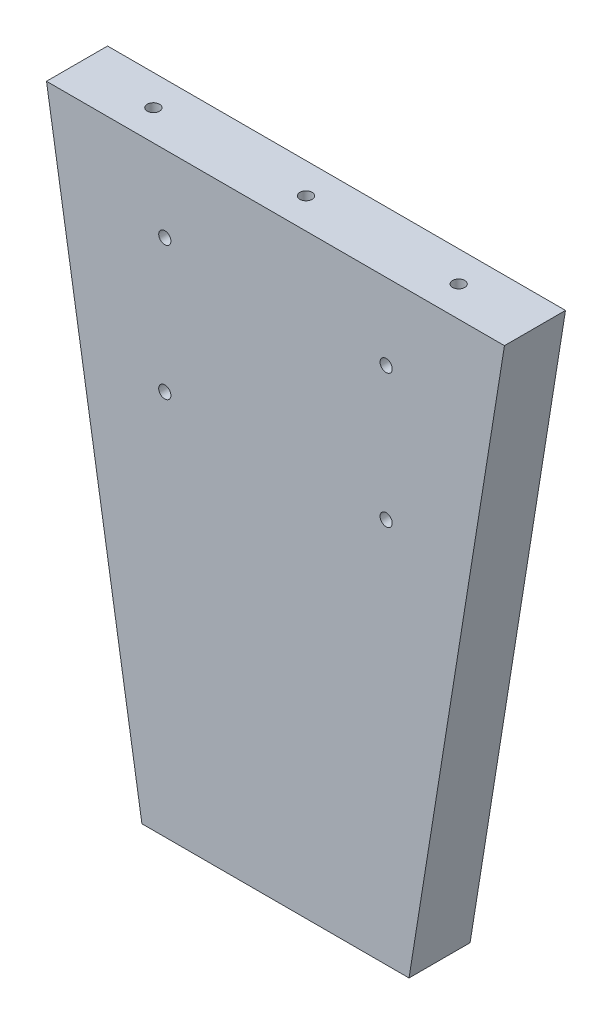
ISO-10303-21;
HEADER;
FILE_DESCRIPTION(('STEP AP214'),'2;1');
FILE_NAME('part.step','',(''),(''),'','','');
FILE_SCHEMA(('AUTOMOTIVE_DESIGN { 1 0 10303 214 1 1 1 1 }'));
ENDSEC;
DATA;
#1=APPLICATION_CONTEXT('core data for automotive mechanical design processes');
#2=APPLICATION_PROTOCOL_DEFINITION('international standard','automotive_design',2000,#1);
#3=PRODUCT_CONTEXT('',#1,'mechanical');
#4=PRODUCT('Part','Part','',(#3));
#5=PRODUCT_RELATED_PRODUCT_CATEGORY('part','',(#4));
#6=PRODUCT_DEFINITION_FORMATION('','',#4);
#7=PRODUCT_DEFINITION_CONTEXT('part definition',#1,'design');
#8=PRODUCT_DEFINITION('design','',#6,#7);
#9=PRODUCT_DEFINITION_SHAPE('','',#8);
#10=(LENGTH_UNIT() NAMED_UNIT(*) SI_UNIT(.MILLI.,.METRE.));
#11=(NAMED_UNIT(*) PLANE_ANGLE_UNIT() SI_UNIT($,.RADIAN.));
#12=(NAMED_UNIT(*) SI_UNIT($,.STERADIAN.) SOLID_ANGLE_UNIT());
#13=UNCERTAINTY_MEASURE_WITH_UNIT(LENGTH_MEASURE(1.E-05),#10,'distance_accuracy_value','');
#14=(GEOMETRIC_REPRESENTATION_CONTEXT(3) GLOBAL_UNCERTAINTY_ASSIGNED_CONTEXT((#13)) GLOBAL_UNIT_ASSIGNED_CONTEXT((#10,
#11,#12)) REPRESENTATION_CONTEXT('',''));
#15=CARTESIAN_POINT('',(0.,0.,0.));
#16=DIRECTION('',(0.,0.,1.));
#17=DIRECTION('',(1.,0.,0.));
#18=AXIS2_PLACEMENT_3D('',#15,#16,#17);
#19=CARTESIAN_POINT('',(0.,156.,8.));
#20=DIRECTION('',(0.,-1.,0.));
#21=DIRECTION('',(0.,0.,-1.));
#22=AXIS2_PLACEMENT_3D('',#19,#20,#21);
#23=PLANE('',#22);
#24=CARTESIAN_POINT('',(40.,156.,0.));
#25=DIRECTION('',(0.,-1.,0.));
#26=DIRECTION('',(0.,0.,-1.));
#27=AXIS2_PLACEMENT_3D('',#24,#25,#26);
#28=CIRCLE('',#27,1.59999999999999);
#29=CARTESIAN_POINT('',(40.,156.,-1.59999999999999));
#30=VERTEX_POINT('',#29);
#31=EDGE_CURVE('E42',#30,#30,#28,.T.);
#32=ORIENTED_EDGE('',*,*,#31,.T.);
#33=EDGE_LOOP('',(#32));
#34=FACE_BOUND('',#33,.T.);
#35=CARTESIAN_POINT('',(0.,156.,0.));
#36=DIRECTION('',(0.,-1.,0.));
#37=DIRECTION('',(0.,0.,-1.));
#38=AXIS2_PLACEMENT_3D('',#35,#36,#37);
#39=CIRCLE('',#38,1.59999999999999);
#40=CARTESIAN_POINT('',(0.,156.,-1.59999999999999));
#41=VERTEX_POINT('',#40);
#42=EDGE_CURVE('E135',#41,#41,#39,.T.);
#43=ORIENTED_EDGE('',*,*,#42,.T.);
#44=EDGE_LOOP('',(#43));
#45=FACE_BOUND('',#44,.T.);
#46=CARTESIAN_POINT('',(-40.,156.,0.));
#47=DIRECTION('',(0.,-1.,0.));
#48=DIRECTION('',(0.,0.,-1.));
#49=AXIS2_PLACEMENT_3D('',#46,#47,#48);
#50=CIRCLE('',#49,1.59999999999999);
#51=CARTESIAN_POINT('',(-40.,156.,-1.59999999999999));
#52=VERTEX_POINT('',#51);
#53=EDGE_CURVE('E131',#52,#52,#50,.T.);
#54=ORIENTED_EDGE('',*,*,#53,.T.);
#55=EDGE_LOOP('',(#54));
#56=FACE_BOUND('',#55,.T.);
#57=DIRECTION('',(-1.,0.,0.));
#58=VECTOR('',#57,1.);
#59=CARTESIAN_POINT('',(0.,156.,-8.));
#60=LINE('',#59,#58);
#61=CARTESIAN_POINT('',(60.,156.,-8.));
#62=VERTEX_POINT('',#61);
#63=CARTESIAN_POINT('',(-60.,156.,-8.));
#64=VERTEX_POINT('',#63);
#65=EDGE_CURVE('E90',#62,#64,#60,.T.);
#66=ORIENTED_EDGE('',*,*,#65,.T.);
#67=DIRECTION('',(0.,0.,-1.));
#68=VECTOR('',#67,1.);
#69=CARTESIAN_POINT('',(-60.,156.,8.));
#70=LINE('',#69,#68);
#71=CARTESIAN_POINT('',(-60.,156.,8.));
#72=VERTEX_POINT('',#71);
#73=EDGE_CURVE('E97',#72,#64,#70,.T.);
#74=ORIENTED_EDGE('',*,*,#73,.F.);
#75=DIRECTION('',(-1.,0.,0.));
#76=VECTOR('',#75,1.);
#77=CARTESIAN_POINT('',(0.,156.,8.));
#78=LINE('',#77,#76);
#79=CARTESIAN_POINT('',(60.,156.,8.));
#80=VERTEX_POINT('',#79);
#81=EDGE_CURVE('E114',#80,#72,#78,.T.);
#82=ORIENTED_EDGE('',*,*,#81,.F.);
#83=DIRECTION('',(0.,0.,-1.));
#84=VECTOR('',#83,1.);
#85=CARTESIAN_POINT('',(60.,156.,8.));
#86=LINE('',#85,#84);
#87=EDGE_CURVE('E48',#80,#62,#86,.T.);
#88=ORIENTED_EDGE('',*,*,#87,.T.);
#89=EDGE_LOOP('',(#66,#74,#82,#88));
#90=FACE_BOUND('',#89,.T.);
#91=ADVANCED_FACE('F39',(#34,#45,#56,#90),#23,.F.);
#92=CARTESIAN_POINT('',(35.,0.,8.));
#93=DIRECTION('',(0.,1.,0.));
#94=DIRECTION('',(-1.,0.,0.));
#95=AXIS2_PLACEMENT_3D('',#92,#93,#94);
#96=PLANE('',#95);
#97=DIRECTION('',(1.,0.,0.));
#98=VECTOR('',#97,1.);
#99=CARTESIAN_POINT('',(35.,0.,-8.));
#100=LINE('',#99,#98);
#101=CARTESIAN_POINT('',(-35.,0.,-8.));
#102=VERTEX_POINT('',#101);
#103=CARTESIAN_POINT('',(35.,0.,-8.));
#104=VERTEX_POINT('',#103);
#105=EDGE_CURVE('E68',#102,#104,#100,.T.);
#106=ORIENTED_EDGE('',*,*,#105,.T.);
#107=DIRECTION('',(0.,0.,-1.));
#108=VECTOR('',#107,1.);
#109=CARTESIAN_POINT('',(35.,0.,8.));
#110=LINE('',#109,#108);
#111=CARTESIAN_POINT('',(35.,0.,8.));
#112=VERTEX_POINT('',#111);
#113=EDGE_CURVE('E11',#112,#104,#110,.T.);
#114=ORIENTED_EDGE('',*,*,#113,.F.);
#115=DIRECTION('',(1.,0.,0.));
#116=VECTOR('',#115,1.);
#117=CARTESIAN_POINT('',(35.,0.,8.));
#118=LINE('',#117,#116);
#119=CARTESIAN_POINT('',(-35.,0.,8.));
#120=VERTEX_POINT('',#119);
#121=EDGE_CURVE('E73',#120,#112,#118,.T.);
#122=ORIENTED_EDGE('',*,*,#121,.F.);
#123=DIRECTION('',(0.,0.,-1.));
#124=VECTOR('',#123,1.);
#125=CARTESIAN_POINT('',(-35.,0.,8.));
#126=LINE('',#125,#124);
#127=EDGE_CURVE('E92',#120,#102,#126,.T.);
#128=ORIENTED_EDGE('',*,*,#127,.T.);
#129=EDGE_LOOP('',(#106,#114,#122,#128));
#130=FACE_BOUND('',#129,.T.);
#131=ADVANCED_FACE('F93',(#130),#96,.F.);
#132=CARTESIAN_POINT('',(35.,0.,8.));
#133=DIRECTION('',(-0.987401103435145,0.158237356319735,0.));
#134=DIRECTION('',(-0.158237356319735,-0.987401103435145,0.));
#135=AXIS2_PLACEMENT_3D('',#132,#133,#134);
#136=PLANE('',#135);
#137=DIRECTION('',(0.158237356319735,0.987401103435145,0.));
#138=VECTOR('',#137,1.);
#139=CARTESIAN_POINT('',(35.,0.,-8.));
#140=LINE('',#139,#138);
#141=EDGE_CURVE('E89',#104,#62,#140,.T.);
#142=ORIENTED_EDGE('',*,*,#141,.T.);
#143=ORIENTED_EDGE('',*,*,#87,.F.);
#144=DIRECTION('',(0.158237356319735,0.987401103435145,0.));
#145=VECTOR('',#144,1.);
#146=CARTESIAN_POINT('',(35.,0.,8.));
#147=LINE('',#146,#145);
#148=EDGE_CURVE('E57',#112,#80,#147,.T.);
#149=ORIENTED_EDGE('',*,*,#148,.F.);
#150=ORIENTED_EDGE('',*,*,#113,.T.);
#151=EDGE_LOOP('',(#142,#143,#149,#150));
#152=FACE_BOUND('',#151,.T.);
#153=ADVANCED_FACE('F199',(#152),#136,.F.);
#154=CARTESIAN_POINT('',(0.,0.,8.));
#155=DIRECTION('',(0.,0.,1.));
#156=DIRECTION('',(1.,0.,0.));
#157=AXIS2_PLACEMENT_3D('',#154,#155,#156);
#158=PLANE('',#157);
#159=CARTESIAN_POINT('',(-28.9999999999999,136.,8.));
#160=DIRECTION('',(0.,0.,1.));
#161=DIRECTION('',(1.,0.,0.));
#162=AXIS2_PLACEMENT_3D('',#159,#160,#161);
#163=CIRCLE('',#162,1.59999999999997);
#164=CARTESIAN_POINT('',(-27.3999999999999,136.,8.));
#165=VERTEX_POINT('',#164);
#166=EDGE_CURVE('E155',#165,#165,#163,.T.);
#167=ORIENTED_EDGE('',*,*,#166,.F.);
#168=EDGE_LOOP('',(#167));
#169=FACE_BOUND('',#168,.T.);
#170=CARTESIAN_POINT('',(-28.9999999999999,101.,8.));
#171=DIRECTION('',(0.,0.,1.));
#172=DIRECTION('',(1.,0.,0.));
#173=AXIS2_PLACEMENT_3D('',#170,#171,#172);
#174=CIRCLE('',#173,1.59999999999997);
#175=CARTESIAN_POINT('',(-27.3999999999999,101.,8.));
#176=VERTEX_POINT('',#175);
#177=EDGE_CURVE('E164',#176,#176,#174,.T.);
#178=ORIENTED_EDGE('',*,*,#177,.F.);
#179=EDGE_LOOP('',(#178));
#180=FACE_BOUND('',#179,.T.);
#181=CARTESIAN_POINT('',(29.0000000000001,101.,8.));
#182=DIRECTION('',(0.,0.,1.));
#183=DIRECTION('',(1.,0.,0.));
#184=AXIS2_PLACEMENT_3D('',#181,#182,#183);
#185=CIRCLE('',#184,1.59999999999997);
#186=CARTESIAN_POINT('',(30.6000000000001,101.,8.));
#187=VERTEX_POINT('',#186);
#188=EDGE_CURVE('E126',#187,#187,#185,.T.);
#189=ORIENTED_EDGE('',*,*,#188,.F.);
#190=EDGE_LOOP('',(#189));
#191=FACE_BOUND('',#190,.T.);
#192=CARTESIAN_POINT('',(29.0000000000001,136.,8.));
#193=DIRECTION('',(0.,0.,1.));
#194=DIRECTION('',(1.,0.,0.));
#195=AXIS2_PLACEMENT_3D('',#192,#193,#194);
#196=CIRCLE('',#195,1.59999999999997);
#197=CARTESIAN_POINT('',(30.6000000000001,136.,8.));
#198=VERTEX_POINT('',#197);
#199=EDGE_CURVE('E104',#198,#198,#196,.T.);
#200=ORIENTED_EDGE('',*,*,#199,.F.);
#201=EDGE_LOOP('',(#200));
#202=FACE_BOUND('',#201,.T.);
#203=ORIENTED_EDGE('',*,*,#81,.T.);
#204=DIRECTION('',(-0.158237356319735,0.987401103435145,0.));
#205=VECTOR('',#204,1.);
#206=CARTESIAN_POINT('',(-35.,0.,8.));
#207=LINE('',#206,#205);
#208=EDGE_CURVE('E98',#120,#72,#207,.T.);
#209=ORIENTED_EDGE('',*,*,#208,.F.);
#210=ORIENTED_EDGE('',*,*,#121,.T.);
#211=ORIENTED_EDGE('',*,*,#148,.T.);
#212=EDGE_LOOP('',(#203,#209,#210,#211));
#213=FACE_BOUND('',#212,.T.);
#214=ADVANCED_FACE('F191',(#169,#180,#191,#202,#213),#158,.T.);
#215=CARTESIAN_POINT('',(0.,0.,-8.));
#216=DIRECTION('',(0.,0.,1.));
#217=DIRECTION('',(1.,0.,0.));
#218=AXIS2_PLACEMENT_3D('',#215,#216,#217);
#219=PLANE('',#218);
#220=CARTESIAN_POINT('',(-28.9999999999999,136.,-7.99999999999999));
#221=DIRECTION('',(0.,0.,-1.));
#222=DIRECTION('',(-1.,0.,0.));
#223=AXIS2_PLACEMENT_3D('',#220,#221,#222);
#224=CIRCLE('',#223,3.15);
#225=CARTESIAN_POINT('',(-32.1499999999999,136.,-7.99999999999999));
#226=VERTEX_POINT('',#225);
#227=EDGE_CURVE('E133',#226,#226,#224,.T.);
#228=ORIENTED_EDGE('',*,*,#227,.F.);
#229=EDGE_LOOP('',(#228));
#230=FACE_BOUND('',#229,.T.);
#231=CARTESIAN_POINT('',(-28.9999999999999,101.,-7.99999999999999));
#232=DIRECTION('',(0.,0.,-1.));
#233=DIRECTION('',(-1.,0.,0.));
#234=AXIS2_PLACEMENT_3D('',#231,#232,#233);
#235=CIRCLE('',#234,3.15);
#236=CARTESIAN_POINT('',(-32.1499999999999,101.,-7.99999999999999));
#237=VERTEX_POINT('',#236);
#238=EDGE_CURVE('E161',#237,#237,#235,.T.);
#239=ORIENTED_EDGE('',*,*,#238,.F.);
#240=EDGE_LOOP('',(#239));
#241=FACE_BOUND('',#240,.T.);
#242=CARTESIAN_POINT('',(29.0000000000001,101.,-7.99999999999999));
#243=DIRECTION('',(0.,0.,-1.));
#244=DIRECTION('',(-1.,0.,0.));
#245=AXIS2_PLACEMENT_3D('',#242,#243,#244);
#246=CIRCLE('',#245,3.15);
#247=CARTESIAN_POINT('',(25.8500000000001,101.,-7.99999999999999));
#248=VERTEX_POINT('',#247);
#249=EDGE_CURVE('E172',#248,#248,#246,.T.);
#250=ORIENTED_EDGE('',*,*,#249,.F.);
#251=EDGE_LOOP('',(#250));
#252=FACE_BOUND('',#251,.T.);
#253=CARTESIAN_POINT('',(29.0000000000001,136.,-7.99999999999999));
#254=DIRECTION('',(0.,0.,-1.));
#255=DIRECTION('',(-1.,0.,0.));
#256=AXIS2_PLACEMENT_3D('',#253,#254,#255);
#257=CIRCLE('',#256,3.15);
#258=CARTESIAN_POINT('',(25.8500000000001,136.,-7.99999999999999));
#259=VERTEX_POINT('',#258);
#260=EDGE_CURVE('E129',#259,#259,#257,.T.);
#261=ORIENTED_EDGE('',*,*,#260,.F.);
#262=EDGE_LOOP('',(#261));
#263=FACE_BOUND('',#262,.T.);
#264=ORIENTED_EDGE('',*,*,#65,.F.);
#265=ORIENTED_EDGE('',*,*,#141,.F.);
#266=ORIENTED_EDGE('',*,*,#105,.F.);
#267=DIRECTION('',(-0.158237356319735,0.987401103435145,0.));
#268=VECTOR('',#267,1.);
#269=CARTESIAN_POINT('',(-35.,0.,-8.));
#270=LINE('',#269,#268);
#271=EDGE_CURVE('E88',#102,#64,#270,.T.);
#272=ORIENTED_EDGE('',*,*,#271,.T.);
#273=EDGE_LOOP('',(#264,#265,#266,#272));
#274=FACE_BOUND('',#273,.T.);
#275=ADVANCED_FACE('F86',(#230,#241,#252,#263,#274),#219,.F.);
#276=CARTESIAN_POINT('',(-35.,0.,8.));
#277=DIRECTION('',(-0.987401103435145,-0.158237356319735,0.));
#278=DIRECTION('',(0.158237356319735,-0.987401103435145,0.));
#279=AXIS2_PLACEMENT_3D('',#276,#277,#278);
#280=PLANE('',#279);
#281=ORIENTED_EDGE('',*,*,#271,.F.);
#282=ORIENTED_EDGE('',*,*,#127,.F.);
#283=ORIENTED_EDGE('',*,*,#208,.T.);
#284=ORIENTED_EDGE('',*,*,#73,.T.);
#285=EDGE_LOOP('',(#281,#282,#283,#284));
#286=FACE_BOUND('',#285,.T.);
#287=ADVANCED_FACE('F101',(#286),#280,.T.);
#288=CARTESIAN_POINT('',(29.0000000000001,136.,-7.99999999999999));
#289=DIRECTION('',(0.,0.,-1.));
#290=DIRECTION('',(-1.,0.,0.));
#291=AXIS2_PLACEMENT_3D('',#288,#289,#290);
#292=CYLINDRICAL_SURFACE('',#291,1.59999999999997);
#293=ORIENTED_EDGE('',*,*,#199,.T.);
#294=EDGE_LOOP('',(#293));
#295=FACE_BOUND('',#294,.T.);
#296=CARTESIAN_POINT('',(29.0000000000001,136.,-6.44999999999994));
#297=DIRECTION('',(0.,0.,-1.));
#298=DIRECTION('',(-1.,0.,0.));
#299=AXIS2_PLACEMENT_3D('',#296,#297,#298);
#300=CIRCLE('',#299,1.59999999999996);
#301=CARTESIAN_POINT('',(27.4000000000001,136.,-6.44999999999994));
#302=VERTEX_POINT('',#301);
#303=EDGE_CURVE('E109',#302,#302,#300,.T.);
#304=ORIENTED_EDGE('',*,*,#303,.T.);
#305=EDGE_LOOP('',(#304));
#306=FACE_BOUND('',#305,.T.);
#307=ADVANCED_FACE('F181',(#295,#306),#292,.F.);
#308=CARTESIAN_POINT('',(29.0000000000001,136.,-7.99999999999999));
#309=DIRECTION('',(0.,0.,-1.));
#310=DIRECTION('',(-1.,0.,0.));
#311=AXIS2_PLACEMENT_3D('',#308,#309,#310);
#312=CONICAL_SURFACE('',#311,3.15,0.785398163397445);
#313=ORIENTED_EDGE('',*,*,#303,.F.);
#314=EDGE_LOOP('',(#313));
#315=FACE_BOUND('',#314,.T.);
#316=ORIENTED_EDGE('',*,*,#260,.T.);
#317=EDGE_LOOP('',(#316));
#318=FACE_BOUND('',#317,.T.);
#319=ADVANCED_FACE('F183',(#315,#318),#312,.F.);
#320=CARTESIAN_POINT('',(29.0000000000001,101.,-7.99999999999999));
#321=DIRECTION('',(0.,0.,-1.));
#322=DIRECTION('',(-1.,0.,0.));
#323=AXIS2_PLACEMENT_3D('',#320,#321,#322);
#324=CYLINDRICAL_SURFACE('',#323,1.59999999999997);
#325=ORIENTED_EDGE('',*,*,#188,.T.);
#326=EDGE_LOOP('',(#325));
#327=FACE_BOUND('',#326,.T.);
#328=CARTESIAN_POINT('',(29.0000000000001,101.,-6.44999999999994));
#329=DIRECTION('',(0.,0.,-1.));
#330=DIRECTION('',(-1.,0.,0.));
#331=AXIS2_PLACEMENT_3D('',#328,#329,#330);
#332=CIRCLE('',#331,1.59999999999996);
#333=CARTESIAN_POINT('',(27.4000000000001,101.,-6.44999999999994));
#334=VERTEX_POINT('',#333);
#335=EDGE_CURVE('E130',#334,#334,#332,.T.);
#336=ORIENTED_EDGE('',*,*,#335,.T.);
#337=EDGE_LOOP('',(#336));
#338=FACE_BOUND('',#337,.T.);
#339=ADVANCED_FACE('F186',(#327,#338),#324,.F.);
#340=CARTESIAN_POINT('',(29.0000000000001,101.,-7.99999999999999));
#341=DIRECTION('',(0.,0.,-1.));
#342=DIRECTION('',(-1.,0.,0.));
#343=AXIS2_PLACEMENT_3D('',#340,#341,#342);
#344=CONICAL_SURFACE('',#343,3.15,0.785398163397445);
#345=ORIENTED_EDGE('',*,*,#335,.F.);
#346=EDGE_LOOP('',(#345));
#347=FACE_BOUND('',#346,.T.);
#348=ORIENTED_EDGE('',*,*,#249,.T.);
#349=EDGE_LOOP('',(#348));
#350=FACE_BOUND('',#349,.T.);
#351=ADVANCED_FACE('F249',(#347,#350),#344,.F.);
#352=CARTESIAN_POINT('',(-28.9999999999999,101.,-7.99999999999999));
#353=DIRECTION('',(0.,0.,-1.));
#354=DIRECTION('',(-1.,0.,0.));
#355=AXIS2_PLACEMENT_3D('',#352,#353,#354);
#356=CYLINDRICAL_SURFACE('',#355,1.59999999999997);
#357=ORIENTED_EDGE('',*,*,#177,.T.);
#358=EDGE_LOOP('',(#357));
#359=FACE_BOUND('',#358,.T.);
#360=CARTESIAN_POINT('',(-28.9999999999999,101.,-6.44999999999994));
#361=DIRECTION('',(0.,0.,-1.));
#362=DIRECTION('',(-1.,0.,0.));
#363=AXIS2_PLACEMENT_3D('',#360,#361,#362);
#364=CIRCLE('',#363,1.59999999999996);
#365=CARTESIAN_POINT('',(-30.5999999999999,101.,-6.44999999999994));
#366=VERTEX_POINT('',#365);
#367=EDGE_CURVE('E168',#366,#366,#364,.T.);
#368=ORIENTED_EDGE('',*,*,#367,.T.);
#369=EDGE_LOOP('',(#368));
#370=FACE_BOUND('',#369,.T.);
#371=ADVANCED_FACE('F256',(#359,#370),#356,.F.);
#372=CARTESIAN_POINT('',(-28.9999999999999,101.,-7.99999999999999));
#373=DIRECTION('',(0.,0.,-1.));
#374=DIRECTION('',(-1.,0.,0.));
#375=AXIS2_PLACEMENT_3D('',#372,#373,#374);
#376=CONICAL_SURFACE('',#375,3.15,0.785398163397445);
#377=ORIENTED_EDGE('',*,*,#367,.F.);
#378=EDGE_LOOP('',(#377));
#379=FACE_BOUND('',#378,.T.);
#380=ORIENTED_EDGE('',*,*,#238,.T.);
#381=EDGE_LOOP('',(#380));
#382=FACE_BOUND('',#381,.T.);
#383=ADVANCED_FACE('F264',(#379,#382),#376,.F.);
#384=CARTESIAN_POINT('',(-28.9999999999999,136.,-7.99999999999999));
#385=DIRECTION('',(0.,0.,-1.));
#386=DIRECTION('',(-1.,0.,0.));
#387=AXIS2_PLACEMENT_3D('',#384,#385,#386);
#388=CYLINDRICAL_SURFACE('',#387,1.59999999999997);
#389=ORIENTED_EDGE('',*,*,#166,.T.);
#390=EDGE_LOOP('',(#389));
#391=FACE_BOUND('',#390,.T.);
#392=CARTESIAN_POINT('',(-28.9999999999999,136.,-6.44999999999994));
#393=DIRECTION('',(0.,0.,-1.));
#394=DIRECTION('',(-1.,0.,0.));
#395=AXIS2_PLACEMENT_3D('',#392,#393,#394);
#396=CIRCLE('',#395,1.59999999999996);
#397=CARTESIAN_POINT('',(-30.5999999999999,136.,-6.44999999999994));
#398=VERTEX_POINT('',#397);
#399=EDGE_CURVE('E158',#398,#398,#396,.T.);
#400=ORIENTED_EDGE('',*,*,#399,.T.);
#401=EDGE_LOOP('',(#400));
#402=FACE_BOUND('',#401,.T.);
#403=ADVANCED_FACE('F272',(#391,#402),#388,.F.);
#404=CARTESIAN_POINT('',(-28.9999999999999,136.,-7.99999999999999));
#405=DIRECTION('',(0.,0.,-1.));
#406=DIRECTION('',(-1.,0.,0.));
#407=AXIS2_PLACEMENT_3D('',#404,#405,#406);
#408=CONICAL_SURFACE('',#407,3.15,0.785398163397445);
#409=ORIENTED_EDGE('',*,*,#399,.F.);
#410=EDGE_LOOP('',(#409));
#411=FACE_BOUND('',#410,.T.);
#412=ORIENTED_EDGE('',*,*,#227,.T.);
#413=EDGE_LOOP('',(#412));
#414=FACE_BOUND('',#413,.T.);
#415=ADVANCED_FACE('F280',(#411,#414),#408,.F.);
#416=CARTESIAN_POINT('',(-40.,172.,0.));
#417=DIRECTION('',(0.,1.,0.));
#418=DIRECTION('',(0.,0.,1.));
#419=AXIS2_PLACEMENT_3D('',#416,#417,#418);
#420=CYLINDRICAL_SURFACE('',#419,1.59999999999999);
#421=CARTESIAN_POINT('',(-40.,132.,0.));
#422=DIRECTION('',(0.,1.,0.));
#423=DIRECTION('',(0.,0.,1.));
#424=AXIS2_PLACEMENT_3D('',#421,#422,#423);
#425=CIRCLE('',#424,1.59999999999998);
#426=CARTESIAN_POINT('',(-40.,132.,1.59999999999998));
#427=VERTEX_POINT('',#426);
#428=EDGE_CURVE('E134',#427,#427,#425,.T.);
#429=ORIENTED_EDGE('',*,*,#428,.F.);
#430=EDGE_LOOP('',(#429));
#431=FACE_BOUND('',#430,.T.);
#432=ORIENTED_EDGE('',*,*,#53,.F.);
#433=EDGE_LOOP('',(#432));
#434=FACE_BOUND('',#433,.T.);
#435=ADVANCED_FACE('F288',(#431,#434),#420,.F.);
#436=CARTESIAN_POINT('',(-40.,132.,0.));
#437=DIRECTION('',(0.,1.,0.));
#438=DIRECTION('',(0.,0.,1.));
#439=AXIS2_PLACEMENT_3D('',#436,#437,#438);
#440=CONICAL_SURFACE('',#439,1.59999999999998,1.02974425867663);
#441=CARTESIAN_POINT('',(-40.,131.038623009556,0.));
#442=VERTEX_POINT('',#441);
#443=VERTEX_LOOP('',#442);
#444=FACE_BOUND('',#443,.T.);
#445=ORIENTED_EDGE('',*,*,#428,.T.);
#446=EDGE_LOOP('',(#445));
#447=FACE_BOUND('',#446,.T.);
#448=ADVANCED_FACE('F297',(#444,#447),#440,.F.);
#449=CARTESIAN_POINT('',(0.,172.,0.));
#450=DIRECTION('',(0.,1.,0.));
#451=DIRECTION('',(0.,0.,1.));
#452=AXIS2_PLACEMENT_3D('',#449,#450,#451);
#453=CYLINDRICAL_SURFACE('',#452,1.59999999999999);
#454=CARTESIAN_POINT('',(0.,132.,0.));
#455=DIRECTION('',(0.,1.,0.));
#456=DIRECTION('',(0.,0.,1.));
#457=AXIS2_PLACEMENT_3D('',#454,#455,#456);
#458=CIRCLE('',#457,1.59999999999998);
#459=CARTESIAN_POINT('',(0.,132.,1.59999999999998));
#460=VERTEX_POINT('',#459);
#461=EDGE_CURVE('E138',#460,#460,#458,.T.);
#462=ORIENTED_EDGE('',*,*,#461,.F.);
#463=EDGE_LOOP('',(#462));
#464=FACE_BOUND('',#463,.T.);
#465=ORIENTED_EDGE('',*,*,#42,.F.);
#466=EDGE_LOOP('',(#465));
#467=FACE_BOUND('',#466,.T.);
#468=ADVANCED_FACE('F305',(#464,#467),#453,.F.);
#469=CARTESIAN_POINT('',(0.,132.,0.));
#470=DIRECTION('',(0.,1.,0.));
#471=DIRECTION('',(0.,0.,1.));
#472=AXIS2_PLACEMENT_3D('',#469,#470,#471);
#473=CONICAL_SURFACE('',#472,1.59999999999998,1.02974425867663);
#474=CARTESIAN_POINT('',(0.,131.038623009556,0.));
#475=VERTEX_POINT('',#474);
#476=VERTEX_LOOP('',#475);
#477=FACE_BOUND('',#476,.T.);
#478=ORIENTED_EDGE('',*,*,#461,.T.);
#479=EDGE_LOOP('',(#478));
#480=FACE_BOUND('',#479,.T.);
#481=ADVANCED_FACE('F313',(#477,#480),#473,.F.);
#482=CARTESIAN_POINT('',(40.,172.,0.));
#483=DIRECTION('',(0.,1.,0.));
#484=DIRECTION('',(0.,0.,1.));
#485=AXIS2_PLACEMENT_3D('',#482,#483,#484);
#486=CYLINDRICAL_SURFACE('',#485,1.59999999999999);
#487=CARTESIAN_POINT('',(40.,132.,0.));
#488=DIRECTION('',(0.,1.,0.));
#489=DIRECTION('',(0.,0.,1.));
#490=AXIS2_PLACEMENT_3D('',#487,#488,#489);
#491=CIRCLE('',#490,1.59999999999998);
#492=CARTESIAN_POINT('',(40.,132.,1.59999999999998));
#493=VERTEX_POINT('',#492);
#494=EDGE_CURVE('E150',#493,#493,#491,.T.);
#495=ORIENTED_EDGE('',*,*,#494,.F.);
#496=EDGE_LOOP('',(#495));
#497=FACE_BOUND('',#496,.T.);
#498=ORIENTED_EDGE('',*,*,#31,.F.);
#499=EDGE_LOOP('',(#498));
#500=FACE_BOUND('',#499,.T.);
#501=ADVANCED_FACE('F321',(#497,#500),#486,.F.);
#502=CARTESIAN_POINT('',(40.,132.,0.));
#503=DIRECTION('',(0.,1.,0.));
#504=DIRECTION('',(0.,0.,1.));
#505=AXIS2_PLACEMENT_3D('',#502,#503,#504);
#506=CONICAL_SURFACE('',#505,1.59999999999998,1.02974425867663);
#507=CARTESIAN_POINT('',(40.,131.038623009556,0.));
#508=VERTEX_POINT('',#507);
#509=VERTEX_LOOP('',#508);
#510=FACE_BOUND('',#509,.T.);
#511=ORIENTED_EDGE('',*,*,#494,.T.);
#512=EDGE_LOOP('',(#511));
#513=FACE_BOUND('',#512,.T.);
#514=ADVANCED_FACE('F329',(#510,#513),#506,.F.);
#515=CLOSED_SHELL('',(#91,#131,#153,#214,#275,#287,#307,#319,#339,#351,#371,#383,#403,#415,#435,
#448,#468,#481,#501,#514));
#516=MANIFOLD_SOLID_BREP('B2',#515);
#517=ADVANCED_BREP_SHAPE_REPRESENTATION('',(#18,#516),#14);
#518=SHAPE_DEFINITION_REPRESENTATION(#9,#517);
ENDSEC;
END-ISO-10303-21;
